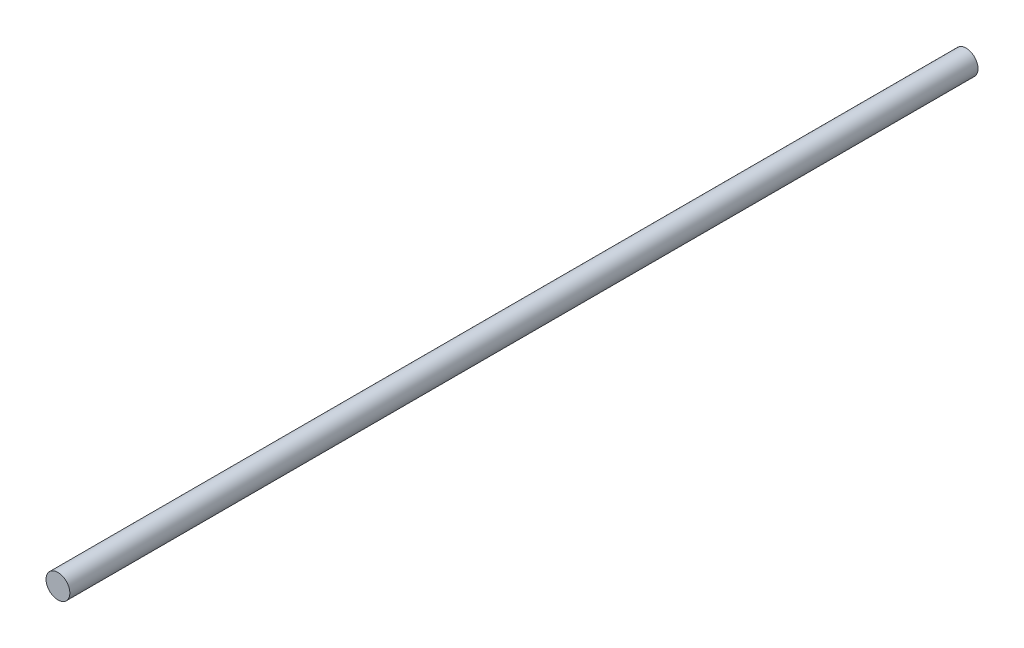
ISO-10303-21;
HEADER;
FILE_DESCRIPTION(('STEP AP214'),'2;1');
FILE_NAME('part.step','',(''),(''),'','','');
FILE_SCHEMA(('AUTOMOTIVE_DESIGN { 1 0 10303 214 1 1 1 1 }'));
ENDSEC;
DATA;
#1=APPLICATION_CONTEXT('core data for automotive mechanical design processes');
#2=APPLICATION_PROTOCOL_DEFINITION('international standard','automotive_design',2000,#1);
#3=PRODUCT_CONTEXT('',#1,'mechanical');
#4=PRODUCT('Part','Part','',(#3));
#5=PRODUCT_RELATED_PRODUCT_CATEGORY('part','',(#4));
#6=PRODUCT_DEFINITION_FORMATION('','',#4);
#7=PRODUCT_DEFINITION_CONTEXT('part definition',#1,'design');
#8=PRODUCT_DEFINITION('design','',#6,#7);
#9=PRODUCT_DEFINITION_SHAPE('','',#8);
#10=(LENGTH_UNIT() NAMED_UNIT(*) SI_UNIT(.MILLI.,.METRE.));
#11=(NAMED_UNIT(*) PLANE_ANGLE_UNIT() SI_UNIT($,.RADIAN.));
#12=(NAMED_UNIT(*) SI_UNIT($,.STERADIAN.) SOLID_ANGLE_UNIT());
#13=UNCERTAINTY_MEASURE_WITH_UNIT(LENGTH_MEASURE(1.E-05),#10,'distance_accuracy_value','');
#14=(GEOMETRIC_REPRESENTATION_CONTEXT(3) GLOBAL_UNCERTAINTY_ASSIGNED_CONTEXT((#13)) GLOBAL_UNIT_ASSIGNED_CONTEXT((#10,
#11,#12)) REPRESENTATION_CONTEXT('',''));
#15=CARTESIAN_POINT('',(0.,0.,0.));
#16=DIRECTION('',(0.,0.,1.));
#17=DIRECTION('',(1.,0.,0.));
#18=AXIS2_PLACEMENT_3D('',#15,#16,#17);
#19=CARTESIAN_POINT('',(0.,0.,457.2));
#20=DIRECTION('',(0.,0.,-1.));
#21=DIRECTION('',(-1.,0.,0.));
#22=AXIS2_PLACEMENT_3D('',#19,#20,#21);
#23=CYLINDRICAL_SURFACE('',#22,6.);
#24=CARTESIAN_POINT('',(0.,0.,457.2));
#25=DIRECTION('',(0.,0.,1.));
#26=DIRECTION('',(1.,0.,0.));
#27=AXIS2_PLACEMENT_3D('',#24,#25,#26);
#28=CIRCLE('',#27,6.);
#29=CARTESIAN_POINT('',(-6.,0.,457.2));
#30=VERTEX_POINT('',#29);
#31=EDGE_CURVE('E10',#30,#30,#28,.T.);
#32=CARTESIAN_POINT('',(0.,0.,0.));
#33=DIRECTION('',(0.,0.,1.));
#34=DIRECTION('',(1.,0.,0.));
#35=AXIS2_PLACEMENT_3D('',#32,#33,#34);
#36=CIRCLE('',#35,6.);
#37=CARTESIAN_POINT('',(-6.,0.,0.));
#38=VERTEX_POINT('',#37);
#39=EDGE_CURVE('E33',#38,#38,#36,.T.);
#40=CARTESIAN_POINT('',(-6.,0.,457.2));
#41=CARTESIAN_POINT('',(-6.,0.,452.4375));
#42=CARTESIAN_POINT('',(-6.,0.,447.675));
#43=CARTESIAN_POINT('',(-6.,0.,438.15));
#44=CARTESIAN_POINT('',(-6.,0.,433.3875));
#45=CARTESIAN_POINT('',(-6.,0.,423.8625));
#46=CARTESIAN_POINT('',(-6.,0.,419.1));
#47=CARTESIAN_POINT('',(-6.,0.,409.575));
#48=CARTESIAN_POINT('',(-6.,0.,404.8125));
#49=CARTESIAN_POINT('',(-6.,0.,395.2875));
#50=CARTESIAN_POINT('',(-6.,0.,390.525));
#51=CARTESIAN_POINT('',(-6.,0.,381.));
#52=CARTESIAN_POINT('',(-6.,0.,376.2375));
#53=CARTESIAN_POINT('',(-6.,0.,366.7125));
#54=CARTESIAN_POINT('',(-6.,0.,361.95));
#55=CARTESIAN_POINT('',(-6.,0.,352.425));
#56=CARTESIAN_POINT('',(-6.,0.,347.6625));
#57=CARTESIAN_POINT('',(-6.,0.,338.1375));
#58=CARTESIAN_POINT('',(-6.,0.,333.375));
#59=CARTESIAN_POINT('',(-6.,0.,323.85));
#60=CARTESIAN_POINT('',(-6.,0.,319.0875));
#61=CARTESIAN_POINT('',(-6.,0.,309.5625));
#62=CARTESIAN_POINT('',(-6.,0.,304.8));
#63=CARTESIAN_POINT('',(-6.,0.,295.275));
#64=CARTESIAN_POINT('',(-6.,0.,290.5125));
#65=CARTESIAN_POINT('',(-6.,0.,280.9875));
#66=CARTESIAN_POINT('',(-6.,0.,276.225));
#67=CARTESIAN_POINT('',(-6.,0.,266.7));
#68=CARTESIAN_POINT('',(-6.,0.,261.9375));
#69=CARTESIAN_POINT('',(-6.,0.,252.4125));
#70=CARTESIAN_POINT('',(-6.,0.,247.65));
#71=CARTESIAN_POINT('',(-6.,0.,238.125));
#72=CARTESIAN_POINT('',(-6.,0.,233.3625));
#73=CARTESIAN_POINT('',(-6.,0.,223.8375));
#74=CARTESIAN_POINT('',(-6.,0.,219.075));
#75=CARTESIAN_POINT('',(-6.,0.,209.55));
#76=CARTESIAN_POINT('',(-6.,0.,204.7875));
#77=CARTESIAN_POINT('',(-6.,0.,195.2625));
#78=CARTESIAN_POINT('',(-6.,0.,190.5));
#79=CARTESIAN_POINT('',(-6.,0.,180.975));
#80=CARTESIAN_POINT('',(-6.,0.,176.2125));
#81=CARTESIAN_POINT('',(-6.,0.,166.6875));
#82=CARTESIAN_POINT('',(-6.,0.,161.925));
#83=CARTESIAN_POINT('',(-6.,0.,152.4));
#84=CARTESIAN_POINT('',(-6.,0.,147.6375));
#85=CARTESIAN_POINT('',(-6.,0.,138.1125));
#86=CARTESIAN_POINT('',(-6.,0.,133.35));
#87=CARTESIAN_POINT('',(-6.,0.,123.825));
#88=CARTESIAN_POINT('',(-6.,0.,119.0625));
#89=CARTESIAN_POINT('',(-6.,0.,109.5375));
#90=CARTESIAN_POINT('',(-6.,0.,104.775));
#91=CARTESIAN_POINT('',(-6.,0.,95.25));
#92=CARTESIAN_POINT('',(-6.,0.,90.4875));
#93=CARTESIAN_POINT('',(-6.,0.,80.9625));
#94=CARTESIAN_POINT('',(-6.,0.,76.2));
#95=CARTESIAN_POINT('',(-6.,0.,66.675));
#96=CARTESIAN_POINT('',(-6.,0.,61.9125));
#97=CARTESIAN_POINT('',(-6.,0.,52.3875));
#98=CARTESIAN_POINT('',(-6.,0.,47.625));
#99=CARTESIAN_POINT('',(-6.,0.,38.1));
#100=CARTESIAN_POINT('',(-6.,0.,33.3375));
#101=CARTESIAN_POINT('',(-6.,0.,23.8125));
#102=CARTESIAN_POINT('',(-6.,0.,19.05));
#103=CARTESIAN_POINT('',(-6.,0.,9.52499999999995));
#104=CARTESIAN_POINT('',(-6.,0.,4.76249999999994));
#105=CARTESIAN_POINT('',(-6.,0.,0.));
#106=B_SPLINE_CURVE_WITH_KNOTS('',3,(#40,#41,#42,#43,#44,#45,#46,#47,#48,#49,#50,#51,#52,#53,
#54,#55,#56,#57,#58,#59,#60,#61,#62,#63,#64,#65,#66,#67,#68,#69,#70,#71,#72,#73,#74,#75,#76,#77,
#78,#79,#80,#81,#82,#83,#84,#85,#86,#87,#88,#89,#90,#91,#92,#93,#94,#95,#96,#97,#98,#99,#100,
#101,#102,#103,#104,#105),.UNSPECIFIED.,.F.,.F.,(4,2,2,2,2,2,2,2,2,2,2,2,2,2,2,2,2,2,2,2,2,2,2,
2,2,2,2,2,2,2,2,2,4),(0.,14.2875,28.575,42.8625,57.15,71.4375,85.7250000000001,100.0125,114.3,
128.5875,142.875,157.1625,171.45,185.7375,200.025,214.3125,228.6,242.8875,257.175,271.4625,
285.75,300.0375,314.325,328.6125,342.9,357.1875,371.475,385.7625,400.05,414.3375,428.625,
442.9125,457.2),.UNSPECIFIED.);
#107=EDGE_CURVE('BSEAM30',#30,#38,#106,.T.);
#108=ORIENTED_EDGE('',*,*,#31,.F.);
#109=ORIENTED_EDGE('',*,*,#39,.T.);
#110=ORIENTED_EDGE('',*,*,#107,.T.);
#111=ORIENTED_EDGE('',*,*,#107,.F.);
#112=EDGE_LOOP('',(#108,#110,#109,#111));
#113=FACE_BOUND('',#112,.T.);
#114=ADVANCED_FACE('F30',(#113),#23,.T.);
#115=CARTESIAN_POINT('',(0.,0.,457.2));
#116=DIRECTION('',(0.,0.,1.));
#117=DIRECTION('',(1.,0.,0.));
#118=AXIS2_PLACEMENT_3D('',#115,#116,#117);
#119=PLANE('',#118);
#120=ORIENTED_EDGE('',*,*,#31,.T.);
#121=EDGE_LOOP('',(#120));
#122=FACE_BOUND('',#121,.T.);
#123=ADVANCED_FACE('F45',(#122),#119,.T.);
#124=CARTESIAN_POINT('',(0.,0.,0.));
#125=DIRECTION('',(0.,0.,1.));
#126=DIRECTION('',(1.,0.,0.));
#127=AXIS2_PLACEMENT_3D('',#124,#125,#126);
#128=PLANE('',#127);
#129=ORIENTED_EDGE('',*,*,#39,.F.);
#130=EDGE_LOOP('',(#129));
#131=FACE_BOUND('',#130,.T.);
#132=ADVANCED_FACE('F43',(#131),#128,.F.);
#133=CLOSED_SHELL('',(#114,#123,#132));
#134=MANIFOLD_SOLID_BREP('B2',#133);
#135=ADVANCED_BREP_SHAPE_REPRESENTATION('',(#18,#134),#14);
#136=SHAPE_DEFINITION_REPRESENTATION(#9,#135);
ENDSEC;
END-ISO-10303-21;
